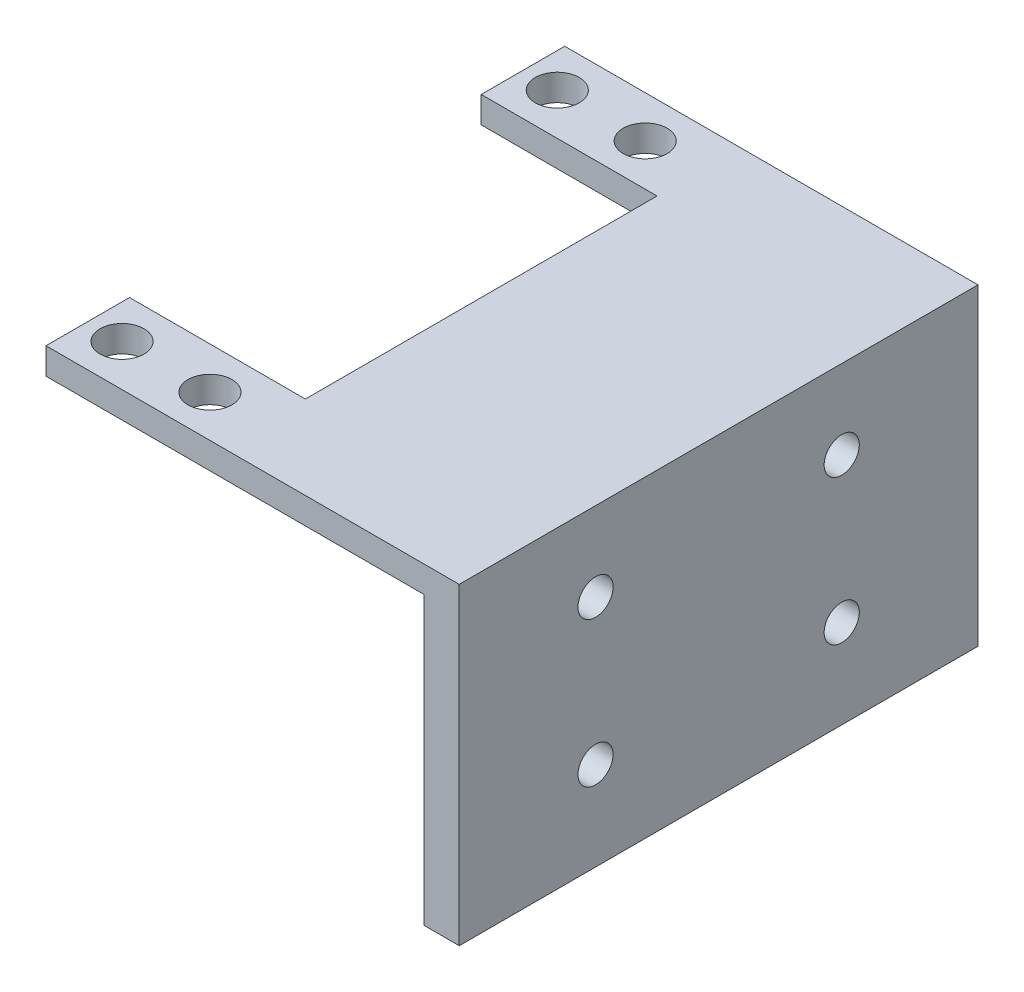
ISO-10303-21;
HEADER;
FILE_DESCRIPTION(('STEP AP214'),'2;1');
FILE_NAME('part.step','',(''),(''),'','','');
FILE_SCHEMA(('AUTOMOTIVE_DESIGN { 1 0 10303 214 1 1 1 1 }'));
ENDSEC;
DATA;
#1=APPLICATION_CONTEXT('core data for automotive mechanical design processes');
#2=APPLICATION_PROTOCOL_DEFINITION('international standard','automotive_design',2000,#1);
#3=PRODUCT_CONTEXT('',#1,'mechanical');
#4=PRODUCT('Part','Part','',(#3));
#5=PRODUCT_RELATED_PRODUCT_CATEGORY('part','',(#4));
#6=PRODUCT_DEFINITION_FORMATION('','',#4);
#7=PRODUCT_DEFINITION_CONTEXT('part definition',#1,'design');
#8=PRODUCT_DEFINITION('design','',#6,#7);
#9=PRODUCT_DEFINITION_SHAPE('','',#8);
#10=(LENGTH_UNIT() NAMED_UNIT(*) SI_UNIT(.MILLI.,.METRE.));
#11=(NAMED_UNIT(*) PLANE_ANGLE_UNIT() SI_UNIT($,.RADIAN.));
#12=(NAMED_UNIT(*) SI_UNIT($,.STERADIAN.) SOLID_ANGLE_UNIT());
#13=UNCERTAINTY_MEASURE_WITH_UNIT(LENGTH_MEASURE(1.E-05),#10,'distance_accuracy_value','');
#14=(GEOMETRIC_REPRESENTATION_CONTEXT(3) GLOBAL_UNCERTAINTY_ASSIGNED_CONTEXT((#13)) GLOBAL_UNIT_ASSIGNED_CONTEXT((#10,
#11,#12)) REPRESENTATION_CONTEXT('',''));
#15=CARTESIAN_POINT('',(0.,0.,0.));
#16=DIRECTION('',(0.,0.,1.));
#17=DIRECTION('',(1.,0.,0.));
#18=AXIS2_PLACEMENT_3D('',#15,#16,#17);
#19=CARTESIAN_POINT('',(0.,0.,59.));
#20=DIRECTION('',(1.,0.,0.));
#21=DIRECTION('',(0.,0.,-1.));
#22=AXIS2_PLACEMENT_3D('',#19,#20,#21);
#23=PLANE('',#22);
#24=DIRECTION('',(0.,0.,-1.));
#25=VECTOR('',#24,1.);
#26=CARTESIAN_POINT('',(0.,35.6,59.));
#27=LINE('',#26,#25);
#28=CARTESIAN_POINT('',(0.,35.6,59.));
#29=VERTEX_POINT('',#28);
#30=CARTESIAN_POINT('',(0.,35.6,49.5));
#31=VERTEX_POINT('',#30);
#32=EDGE_CURVE('E233',#29,#31,#27,.T.);
#33=ORIENTED_EDGE('',*,*,#32,.T.);
#34=DIRECTION('',(0.,-1.,0.));
#35=VECTOR('',#34,1.);
#36=CARTESIAN_POINT('',(0.,81.6,49.5));
#37=LINE('',#36,#35);
#38=CARTESIAN_POINT('',(0.,32.6,49.5));
#39=VERTEX_POINT('',#38);
#40=EDGE_CURVE('E148',#31,#39,#37,.T.);
#41=ORIENTED_EDGE('',*,*,#40,.T.);
#42=DIRECTION('',(0.,0.,1.));
#43=VECTOR('',#42,1.);
#44=CARTESIAN_POINT('',(0.,32.6,0.));
#45=LINE('',#44,#43);
#46=CARTESIAN_POINT('',(0.,32.6,59.));
#47=VERTEX_POINT('',#46);
#48=EDGE_CURVE('E181',#39,#47,#45,.T.);
#49=ORIENTED_EDGE('',*,*,#48,.T.);
#50=DIRECTION('',(0.,-1.,0.));
#51=VECTOR('',#50,1.);
#52=CARTESIAN_POINT('',(0.,0.,59.));
#53=LINE('',#52,#51);
#54=EDGE_CURVE('E206',#29,#47,#53,.T.);
#55=ORIENTED_EDGE('',*,*,#54,.F.);
#56=EDGE_LOOP('',(#33,#41,#49,#55));
#57=FACE_BOUND('',#56,.T.);
#58=ADVANCED_FACE('F40',(#57),#23,.F.);
#59=CARTESIAN_POINT('',(0.,32.6,0.));
#60=VERTEX_POINT('',#59);
#61=CARTESIAN_POINT('',(0.,32.6,9.5));
#62=VERTEX_POINT('',#61);
#63=EDGE_CURVE('E186',#60,#62,#45,.T.);
#64=ORIENTED_EDGE('',*,*,#63,.T.);
#65=DIRECTION('',(0.,-1.,0.));
#66=VECTOR('',#65,1.);
#67=CARTESIAN_POINT('',(0.,81.6,9.5));
#68=LINE('',#67,#66);
#69=CARTESIAN_POINT('',(0.,35.6,9.5));
#70=VERTEX_POINT('',#69);
#71=EDGE_CURVE('E56',#70,#62,#68,.T.);
#72=ORIENTED_EDGE('',*,*,#71,.F.);
#73=CARTESIAN_POINT('',(0.,35.6,0.));
#74=VERTEX_POINT('',#73);
#75=EDGE_CURVE('E220',#70,#74,#27,.T.);
#76=ORIENTED_EDGE('',*,*,#75,.T.);
#77=DIRECTION('',(0.,-1.,0.));
#78=VECTOR('',#77,1.);
#79=CARTESIAN_POINT('',(0.,0.,0.));
#80=LINE('',#79,#78);
#81=EDGE_CURVE('E202',#74,#60,#80,.T.);
#82=ORIENTED_EDGE('',*,*,#81,.T.);
#83=EDGE_LOOP('',(#64,#72,#76,#82));
#84=FACE_BOUND('',#83,.T.);
#85=ADVANCED_FACE('F42',(#84),#23,.F.);
#86=CARTESIAN_POINT('',(0.,0.,59.));
#87=DIRECTION('',(0.,0.,-1.));
#88=DIRECTION('',(-1.,0.,0.));
#89=AXIS2_PLACEMENT_3D('',#86,#87,#88);
#90=PLANE('',#89);
#91=DIRECTION('',(-1.,0.,0.));
#92=VECTOR('',#91,1.);
#93=CARTESIAN_POINT('',(43.,32.6,59.));
#94=LINE('',#93,#92);
#95=CARTESIAN_POINT('',(43.,32.6,59.));
#96=VERTEX_POINT('',#95);
#97=EDGE_CURVE('E195',#96,#47,#94,.T.);
#98=ORIENTED_EDGE('',*,*,#97,.F.);
#99=DIRECTION('',(0.,-1.,0.));
#100=VECTOR('',#99,1.);
#101=CARTESIAN_POINT('',(43.,32.6,59.));
#102=LINE('',#101,#100);
#103=CARTESIAN_POINT('',(43.,0.,59.));
#104=VERTEX_POINT('',#103);
#105=EDGE_CURVE('E185',#96,#104,#102,.T.);
#106=ORIENTED_EDGE('',*,*,#105,.T.);
#107=DIRECTION('',(1.,0.,0.));
#108=VECTOR('',#107,1.);
#109=CARTESIAN_POINT('',(0.,0.,59.));
#110=LINE('',#109,#108);
#111=CARTESIAN_POINT('',(47.,0.,59.));
#112=VERTEX_POINT('',#111);
#113=EDGE_CURVE('E210',#104,#112,#110,.T.);
#114=ORIENTED_EDGE('',*,*,#113,.T.);
#115=DIRECTION('',(0.,1.,0.));
#116=VECTOR('',#115,1.);
#117=CARTESIAN_POINT('',(47.,0.,59.));
#118=LINE('',#117,#116);
#119=CARTESIAN_POINT('',(47.,35.6,59.));
#120=VERTEX_POINT('',#119);
#121=EDGE_CURVE('E214',#112,#120,#118,.T.);
#122=ORIENTED_EDGE('',*,*,#121,.T.);
#123=DIRECTION('',(-1.,0.,0.));
#124=VECTOR('',#123,1.);
#125=CARTESIAN_POINT('',(0.,35.6,59.));
#126=LINE('',#125,#124);
#127=EDGE_CURVE('E217',#120,#29,#126,.T.);
#128=ORIENTED_EDGE('',*,*,#127,.T.);
#129=ORIENTED_EDGE('',*,*,#54,.T.);
#130=EDGE_LOOP('',(#98,#106,#114,#122,#128,#129));
#131=FACE_BOUND('',#130,.T.);
#132=ADVANCED_FACE('F291',(#131),#90,.F.);
#133=CARTESIAN_POINT('',(0.,0.,0.));
#134=DIRECTION('',(0.,0.,-1.));
#135=DIRECTION('',(-1.,0.,0.));
#136=AXIS2_PLACEMENT_3D('',#133,#134,#135);
#137=PLANE('',#136);
#138=DIRECTION('',(0.,-1.,0.));
#139=VECTOR('',#138,1.);
#140=CARTESIAN_POINT('',(43.,32.6,0.));
#141=LINE('',#140,#139);
#142=CARTESIAN_POINT('',(43.,32.6,0.));
#143=VERTEX_POINT('',#142);
#144=CARTESIAN_POINT('',(43.,0.,0.));
#145=VERTEX_POINT('',#144);
#146=EDGE_CURVE('E192',#143,#145,#141,.T.);
#147=ORIENTED_EDGE('',*,*,#146,.F.);
#148=DIRECTION('',(-1.,0.,0.));
#149=VECTOR('',#148,1.);
#150=CARTESIAN_POINT('',(43.,32.6,0.));
#151=LINE('',#150,#149);
#152=EDGE_CURVE('E198',#143,#60,#151,.T.);
#153=ORIENTED_EDGE('',*,*,#152,.T.);
#154=ORIENTED_EDGE('',*,*,#81,.F.);
#155=DIRECTION('',(-1.,0.,0.));
#156=VECTOR('',#155,1.);
#157=CARTESIAN_POINT('',(0.,35.6,0.));
#158=LINE('',#157,#156);
#159=CARTESIAN_POINT('',(47.,35.6,0.));
#160=VERTEX_POINT('',#159);
#161=EDGE_CURVE('E211',#160,#74,#158,.T.);
#162=ORIENTED_EDGE('',*,*,#161,.F.);
#163=DIRECTION('',(0.,1.,0.));
#164=VECTOR('',#163,1.);
#165=CARTESIAN_POINT('',(47.,0.,0.));
#166=LINE('',#165,#164);
#167=CARTESIAN_POINT('',(47.,0.,0.));
#168=VERTEX_POINT('',#167);
#169=EDGE_CURVE('E227',#168,#160,#166,.T.);
#170=ORIENTED_EDGE('',*,*,#169,.F.);
#171=DIRECTION('',(1.,0.,0.));
#172=VECTOR('',#171,1.);
#173=CARTESIAN_POINT('',(0.,0.,0.));
#174=LINE('',#173,#172);
#175=EDGE_CURVE('E224',#145,#168,#174,.T.);
#176=ORIENTED_EDGE('',*,*,#175,.F.);
#177=EDGE_LOOP('',(#147,#153,#154,#162,#170,#176));
#178=FACE_BOUND('',#177,.T.);
#179=ADVANCED_FACE('F252',(#178),#137,.T.);
#180=CARTESIAN_POINT('',(0.,0.,59.));
#181=DIRECTION('',(0.,1.,0.));
#182=DIRECTION('',(0.,0.,1.));
#183=AXIS2_PLACEMENT_3D('',#180,#181,#182);
#184=PLANE('',#183);
#185=ORIENTED_EDGE('',*,*,#113,.F.);
#186=DIRECTION('',(0.,0.,1.));
#187=VECTOR('',#186,1.);
#188=CARTESIAN_POINT('',(43.,0.,0.));
#189=LINE('',#188,#187);
#190=EDGE_CURVE('E182',#145,#104,#189,.T.);
#191=ORIENTED_EDGE('',*,*,#190,.F.);
#192=ORIENTED_EDGE('',*,*,#175,.T.);
#193=DIRECTION('',(0.,0.,-1.));
#194=VECTOR('',#193,1.);
#195=CARTESIAN_POINT('',(47.,0.,59.));
#196=LINE('',#195,#194);
#197=EDGE_CURVE('E11',#112,#168,#196,.T.);
#198=ORIENTED_EDGE('',*,*,#197,.F.);
#199=EDGE_LOOP('',(#185,#191,#192,#198));
#200=FACE_BOUND('',#199,.T.);
#201=ADVANCED_FACE('F317',(#200),#184,.F.);
#202=CARTESIAN_POINT('',(47.,0.,59.));
#203=DIRECTION('',(-1.,0.,0.));
#204=DIRECTION('',(0.,0.,1.));
#205=AXIS2_PLACEMENT_3D('',#202,#203,#204);
#206=PLANE('',#205);
#207=CARTESIAN_POINT('',(47.,26.6,43.5));
#208=DIRECTION('',(-1.,0.,0.));
#209=DIRECTION('',(0.,0.,1.));
#210=AXIS2_PLACEMENT_3D('',#207,#208,#209);
#211=CIRCLE('',#210,2.);
#212=CARTESIAN_POINT('',(47.,26.6,45.5));
#213=VERTEX_POINT('',#212);
#214=EDGE_CURVE('E524',#213,#213,#211,.T.);
#215=ORIENTED_EDGE('',*,*,#214,.T.);
#216=EDGE_LOOP('',(#215));
#217=FACE_BOUND('',#216,.T.);
#218=CARTESIAN_POINT('',(47.,10.1,15.5));
#219=DIRECTION('',(-1.,0.,0.));
#220=DIRECTION('',(0.,0.,1.));
#221=AXIS2_PLACEMENT_3D('',#218,#219,#220);
#222=CIRCLE('',#221,2.);
#223=CARTESIAN_POINT('',(47.,10.1,17.5));
#224=VERTEX_POINT('',#223);
#225=EDGE_CURVE('E527',#224,#224,#222,.T.);
#226=ORIENTED_EDGE('',*,*,#225,.T.);
#227=EDGE_LOOP('',(#226));
#228=FACE_BOUND('',#227,.T.);
#229=CARTESIAN_POINT('',(47.,10.1,43.5));
#230=DIRECTION('',(-1.,0.,0.));
#231=DIRECTION('',(0.,0.,1.));
#232=AXIS2_PLACEMENT_3D('',#229,#230,#231);
#233=CIRCLE('',#232,2.);
#234=CARTESIAN_POINT('',(47.,10.1,45.5));
#235=VERTEX_POINT('',#234);
#236=EDGE_CURVE('E536',#235,#235,#233,.T.);
#237=ORIENTED_EDGE('',*,*,#236,.T.);
#238=EDGE_LOOP('',(#237));
#239=FACE_BOUND('',#238,.T.);
#240=CARTESIAN_POINT('',(47.,26.6,15.5));
#241=DIRECTION('',(-1.,0.,0.));
#242=DIRECTION('',(0.,0.,1.));
#243=AXIS2_PLACEMENT_3D('',#240,#241,#242);
#244=CIRCLE('',#243,2.);
#245=CARTESIAN_POINT('',(47.,26.6,17.5));
#246=VERTEX_POINT('',#245);
#247=EDGE_CURVE('E574',#246,#246,#244,.T.);
#248=ORIENTED_EDGE('',*,*,#247,.T.);
#249=EDGE_LOOP('',(#248));
#250=FACE_BOUND('',#249,.T.);
#251=ORIENTED_EDGE('',*,*,#169,.T.);
#252=DIRECTION('',(0.,0.,-1.));
#253=VECTOR('',#252,1.);
#254=CARTESIAN_POINT('',(47.,35.6,59.));
#255=LINE('',#254,#253);
#256=EDGE_CURVE('E49',#120,#160,#255,.T.);
#257=ORIENTED_EDGE('',*,*,#256,.F.);
#258=ORIENTED_EDGE('',*,*,#121,.F.);
#259=ORIENTED_EDGE('',*,*,#197,.T.);
#260=EDGE_LOOP('',(#251,#257,#258,#259));
#261=FACE_BOUND('',#260,.T.);
#262=ADVANCED_FACE('F323',(#217,#228,#239,#250,#261),#206,.F.);
#263=CARTESIAN_POINT('',(0.,35.6,59.));
#264=DIRECTION('',(0.,-1.,0.));
#265=DIRECTION('',(0.,0.,-1.));
#266=AXIS2_PLACEMENT_3D('',#263,#264,#265);
#267=PLANE('',#266);
#268=CARTESIAN_POINT('',(3.9,35.6,54.25));
#269=DIRECTION('',(0.,-1.,0.));
#270=DIRECTION('',(0.,0.,-1.));
#271=AXIS2_PLACEMENT_3D('',#268,#269,#270);
#272=CIRCLE('',#271,2.5);
#273=CARTESIAN_POINT('',(3.9,35.6,51.75));
#274=VERTEX_POINT('',#273);
#275=EDGE_CURVE('E177',#274,#274,#272,.T.);
#276=ORIENTED_EDGE('',*,*,#275,.T.);
#277=EDGE_LOOP('',(#276));
#278=FACE_BOUND('',#277,.T.);
#279=CARTESIAN_POINT('',(13.9,35.6,4.75));
#280=DIRECTION('',(0.,-1.,0.));
#281=DIRECTION('',(0.,0.,-1.));
#282=AXIS2_PLACEMENT_3D('',#279,#280,#281);
#283=CIRCLE('',#282,2.49999999999999);
#284=CARTESIAN_POINT('',(13.9,35.6,2.25));
#285=VERTEX_POINT('',#284);
#286=EDGE_CURVE('E173',#285,#285,#283,.T.);
#287=ORIENTED_EDGE('',*,*,#286,.T.);
#288=EDGE_LOOP('',(#287));
#289=FACE_BOUND('',#288,.T.);
#290=CARTESIAN_POINT('',(13.9,35.6,54.25));
#291=DIRECTION('',(0.,-1.,0.));
#292=DIRECTION('',(0.,0.,-1.));
#293=AXIS2_PLACEMENT_3D('',#290,#291,#292);
#294=CIRCLE('',#293,2.5);
#295=CARTESIAN_POINT('',(13.9,35.6,51.75));
#296=VERTEX_POINT('',#295);
#297=EDGE_CURVE('E169',#296,#296,#294,.T.);
#298=ORIENTED_EDGE('',*,*,#297,.T.);
#299=EDGE_LOOP('',(#298));
#300=FACE_BOUND('',#299,.T.);
#301=CARTESIAN_POINT('',(3.9,35.6,4.75));
#302=DIRECTION('',(0.,-1.,0.));
#303=DIRECTION('',(0.,0.,-1.));
#304=AXIS2_PLACEMENT_3D('',#301,#302,#303);
#305=CIRCLE('',#304,2.5);
#306=CARTESIAN_POINT('',(3.9,35.6,2.25));
#307=VERTEX_POINT('',#306);
#308=EDGE_CURVE('E165',#307,#307,#305,.T.);
#309=ORIENTED_EDGE('',*,*,#308,.T.);
#310=EDGE_LOOP('',(#309));
#311=FACE_BOUND('',#310,.T.);
#312=DIRECTION('',(0.,0.,1.));
#313=VECTOR('',#312,1.);
#314=CARTESIAN_POINT('',(20.,35.6,59.));
#315=LINE('',#314,#313);
#316=CARTESIAN_POINT('',(20.,35.6,9.5));
#317=VERTEX_POINT('',#316);
#318=CARTESIAN_POINT('',(20.,35.6,49.5));
#319=VERTEX_POINT('',#318);
#320=EDGE_CURVE('E126',#317,#319,#315,.T.);
#321=ORIENTED_EDGE('',*,*,#320,.T.);
#322=DIRECTION('',(-1.,0.,0.));
#323=VECTOR('',#322,1.);
#324=CARTESIAN_POINT('',(0.,35.6,49.5));
#325=LINE('',#324,#323);
#326=EDGE_CURVE('E161',#319,#31,#325,.T.);
#327=ORIENTED_EDGE('',*,*,#326,.T.);
#328=ORIENTED_EDGE('',*,*,#32,.F.);
#329=ORIENTED_EDGE('',*,*,#127,.F.);
#330=ORIENTED_EDGE('',*,*,#256,.T.);
#331=ORIENTED_EDGE('',*,*,#161,.T.);
#332=ORIENTED_EDGE('',*,*,#75,.F.);
#333=DIRECTION('',(1.,0.,0.));
#334=VECTOR('',#333,1.);
#335=CARTESIAN_POINT('',(0.,35.6,9.5));
#336=LINE('',#335,#334);
#337=EDGE_CURVE('E152',#70,#317,#336,.T.);
#338=ORIENTED_EDGE('',*,*,#337,.T.);
#339=EDGE_LOOP('',(#321,#327,#328,#329,#330,#331,#332,#338));
#340=FACE_BOUND('',#339,.T.);
#341=ADVANCED_FACE('F243',(#278,#289,#300,#311,#340),#267,.F.);
#342=CARTESIAN_POINT('',(43.,32.6,0.));
#343=DIRECTION('',(0.,-1.,0.));
#344=DIRECTION('',(0.,0.,-1.));
#345=AXIS2_PLACEMENT_3D('',#342,#343,#344);
#346=PLANE('',#345);
#347=CARTESIAN_POINT('',(3.9,32.6,54.25));
#348=DIRECTION('',(0.,-1.,0.));
#349=DIRECTION('',(0.,0.,-1.));
#350=AXIS2_PLACEMENT_3D('',#347,#348,#349);
#351=CIRCLE('',#350,2.5);
#352=CARTESIAN_POINT('',(3.9,32.6,51.75));
#353=VERTEX_POINT('',#352);
#354=EDGE_CURVE('E136',#353,#353,#351,.T.);
#355=ORIENTED_EDGE('',*,*,#354,.F.);
#356=EDGE_LOOP('',(#355));
#357=FACE_BOUND('',#356,.T.);
#358=CARTESIAN_POINT('',(13.9,32.6,4.75));
#359=DIRECTION('',(0.,-1.,0.));
#360=DIRECTION('',(0.,0.,1.));
#361=AXIS2_PLACEMENT_3D('',#358,#359,#360);
#362=CIRCLE('',#361,2.49999999999999);
#363=CARTESIAN_POINT('',(13.9,32.6,7.24999999999999));
#364=VERTEX_POINT('',#363);
#365=EDGE_CURVE('E542',#364,#364,#362,.T.);
#366=ORIENTED_EDGE('',*,*,#365,.F.);
#367=EDGE_LOOP('',(#366));
#368=FACE_BOUND('',#367,.T.);
#369=CARTESIAN_POINT('',(13.9,32.6,54.25));
#370=DIRECTION('',(0.,-1.,0.));
#371=DIRECTION('',(0.,0.,-1.));
#372=AXIS2_PLACEMENT_3D('',#369,#370,#371);
#373=CIRCLE('',#372,2.5);
#374=CARTESIAN_POINT('',(13.9,32.6,51.75));
#375=VERTEX_POINT('',#374);
#376=EDGE_CURVE('E533',#375,#375,#373,.T.);
#377=ORIENTED_EDGE('',*,*,#376,.F.);
#378=EDGE_LOOP('',(#377));
#379=FACE_BOUND('',#378,.T.);
#380=CARTESIAN_POINT('',(3.9,32.6,4.75));
#381=DIRECTION('',(0.,-1.,0.));
#382=DIRECTION('',(0.,0.,1.));
#383=AXIS2_PLACEMENT_3D('',#380,#381,#382);
#384=CIRCLE('',#383,2.5);
#385=CARTESIAN_POINT('',(3.9,32.6,7.24999999999999));
#386=VERTEX_POINT('',#385);
#387=EDGE_CURVE('E526',#386,#386,#384,.T.);
#388=ORIENTED_EDGE('',*,*,#387,.F.);
#389=EDGE_LOOP('',(#388));
#390=FACE_BOUND('',#389,.T.);
#391=DIRECTION('',(-1.,0.,0.));
#392=VECTOR('',#391,1.);
#393=CARTESIAN_POINT('',(0.,32.6,49.5));
#394=LINE('',#393,#392);
#395=CARTESIAN_POINT('',(20.,32.6,49.5));
#396=VERTEX_POINT('',#395);
#397=EDGE_CURVE('E140',#396,#39,#394,.T.);
#398=ORIENTED_EDGE('',*,*,#397,.F.);
#399=DIRECTION('',(0.,0.,1.));
#400=VECTOR('',#399,1.);
#401=CARTESIAN_POINT('',(20.,32.6,9.5));
#402=LINE('',#401,#400);
#403=CARTESIAN_POINT('',(20.,32.6,9.5));
#404=VERTEX_POINT('',#403);
#405=EDGE_CURVE('E123',#404,#396,#402,.T.);
#406=ORIENTED_EDGE('',*,*,#405,.F.);
#407=DIRECTION('',(1.,0.,0.));
#408=VECTOR('',#407,1.);
#409=CARTESIAN_POINT('',(0.,32.6,9.5));
#410=LINE('',#409,#408);
#411=EDGE_CURVE('E131',#62,#404,#410,.T.);
#412=ORIENTED_EDGE('',*,*,#411,.F.);
#413=ORIENTED_EDGE('',*,*,#63,.F.);
#414=ORIENTED_EDGE('',*,*,#152,.F.);
#415=DIRECTION('',(0.,0.,1.));
#416=VECTOR('',#415,1.);
#417=CARTESIAN_POINT('',(43.,32.6,0.));
#418=LINE('',#417,#416);
#419=EDGE_CURVE('E64',#143,#96,#418,.T.);
#420=ORIENTED_EDGE('',*,*,#419,.T.);
#421=ORIENTED_EDGE('',*,*,#97,.T.);
#422=ORIENTED_EDGE('',*,*,#48,.F.);
#423=EDGE_LOOP('',(#398,#406,#412,#413,#414,#420,#421,#422));
#424=FACE_BOUND('',#423,.T.);
#425=ADVANCED_FACE('F138',(#357,#368,#379,#390,#424),#346,.T.);
#426=CARTESIAN_POINT('',(43.,0.,0.));
#427=DIRECTION('',(1.,0.,0.));
#428=DIRECTION('',(0.,0.,-1.));
#429=AXIS2_PLACEMENT_3D('',#426,#427,#428);
#430=PLANE('',#429);
#431=CARTESIAN_POINT('',(43.,26.6,43.5));
#432=DIRECTION('',(-1.,0.,0.));
#433=DIRECTION('',(0.,0.,1.));
#434=AXIS2_PLACEMENT_3D('',#431,#432,#433);
#435=CIRCLE('',#434,2.);
#436=CARTESIAN_POINT('',(43.,26.6,45.5));
#437=VERTEX_POINT('',#436);
#438=EDGE_CURVE('E521',#437,#437,#435,.T.);
#439=ORIENTED_EDGE('',*,*,#438,.F.);
#440=EDGE_LOOP('',(#439));
#441=FACE_BOUND('',#440,.T.);
#442=CARTESIAN_POINT('',(43.,10.1,15.5));
#443=DIRECTION('',(-1.,0.,0.));
#444=DIRECTION('',(0.,0.,1.));
#445=AXIS2_PLACEMENT_3D('',#442,#443,#444);
#446=CIRCLE('',#445,2.);
#447=CARTESIAN_POINT('',(43.,10.1,17.5));
#448=VERTEX_POINT('',#447);
#449=EDGE_CURVE('E585',#448,#448,#446,.T.);
#450=ORIENTED_EDGE('',*,*,#449,.F.);
#451=EDGE_LOOP('',(#450));
#452=FACE_BOUND('',#451,.T.);
#453=CARTESIAN_POINT('',(43.,10.1,43.5));
#454=DIRECTION('',(-1.,0.,0.));
#455=DIRECTION('',(0.,0.,1.));
#456=AXIS2_PLACEMENT_3D('',#453,#454,#455);
#457=CIRCLE('',#456,2.);
#458=CARTESIAN_POINT('',(43.,10.1,45.5));
#459=VERTEX_POINT('',#458);
#460=EDGE_CURVE('E582',#459,#459,#457,.T.);
#461=ORIENTED_EDGE('',*,*,#460,.F.);
#462=EDGE_LOOP('',(#461));
#463=FACE_BOUND('',#462,.T.);
#464=CARTESIAN_POINT('',(43.,26.6,15.5));
#465=DIRECTION('',(-1.,0.,0.));
#466=DIRECTION('',(0.,0.,1.));
#467=AXIS2_PLACEMENT_3D('',#464,#465,#466);
#468=CIRCLE('',#467,2.);
#469=CARTESIAN_POINT('',(43.,26.6,17.5));
#470=VERTEX_POINT('',#469);
#471=EDGE_CURVE('E578',#470,#470,#468,.T.);
#472=ORIENTED_EDGE('',*,*,#471,.F.);
#473=EDGE_LOOP('',(#472));
#474=FACE_BOUND('',#473,.T.);
#475=ORIENTED_EDGE('',*,*,#190,.T.);
#476=ORIENTED_EDGE('',*,*,#105,.F.);
#477=ORIENTED_EDGE('',*,*,#419,.F.);
#478=ORIENTED_EDGE('',*,*,#146,.T.);
#479=EDGE_LOOP('',(#475,#476,#477,#478));
#480=FACE_BOUND('',#479,.T.);
#481=ADVANCED_FACE('F295',(#441,#452,#463,#474,#480),#430,.F.);
#482=CARTESIAN_POINT('',(0.,81.6,49.5));
#483=DIRECTION('',(0.,0.,1.));
#484=DIRECTION('',(1.,0.,0.));
#485=AXIS2_PLACEMENT_3D('',#482,#483,#484);
#486=PLANE('',#485);
#487=DIRECTION('',(0.,-1.,0.));
#488=VECTOR('',#487,1.);
#489=CARTESIAN_POINT('',(20.,81.6,49.5));
#490=LINE('',#489,#488);
#491=EDGE_CURVE('E129',#319,#396,#490,.T.);
#492=ORIENTED_EDGE('',*,*,#491,.T.);
#493=ORIENTED_EDGE('',*,*,#397,.T.);
#494=ORIENTED_EDGE('',*,*,#40,.F.);
#495=ORIENTED_EDGE('',*,*,#326,.F.);
#496=EDGE_LOOP('',(#492,#493,#494,#495));
#497=FACE_BOUND('',#496,.T.);
#498=ADVANCED_FACE('F293',(#497),#486,.F.);
#499=CARTESIAN_POINT('',(20.,81.6,9.5));
#500=DIRECTION('',(1.,0.,0.));
#501=DIRECTION('',(0.,0.,-1.));
#502=AXIS2_PLACEMENT_3D('',#499,#500,#501);
#503=PLANE('',#502);
#504=DIRECTION('',(0.,-1.,0.));
#505=VECTOR('',#504,1.);
#506=CARTESIAN_POINT('',(20.,81.6,9.5));
#507=LINE('',#506,#505);
#508=EDGE_CURVE('E119',#317,#404,#507,.T.);
#509=ORIENTED_EDGE('',*,*,#508,.T.);
#510=ORIENTED_EDGE('',*,*,#405,.T.);
#511=ORIENTED_EDGE('',*,*,#491,.F.);
#512=ORIENTED_EDGE('',*,*,#320,.F.);
#513=EDGE_LOOP('',(#509,#510,#511,#512));
#514=FACE_BOUND('',#513,.T.);
#515=ADVANCED_FACE('F120',(#514),#503,.F.);
#516=CARTESIAN_POINT('',(0.,81.6,9.5));
#517=DIRECTION('',(0.,0.,-1.));
#518=DIRECTION('',(-1.,0.,0.));
#519=AXIS2_PLACEMENT_3D('',#516,#517,#518);
#520=PLANE('',#519);
#521=ORIENTED_EDGE('',*,*,#71,.T.);
#522=ORIENTED_EDGE('',*,*,#411,.T.);
#523=ORIENTED_EDGE('',*,*,#508,.F.);
#524=ORIENTED_EDGE('',*,*,#337,.F.);
#525=EDGE_LOOP('',(#521,#522,#523,#524));
#526=FACE_BOUND('',#525,.T.);
#527=ADVANCED_FACE('F132',(#526),#520,.F.);
#528=CARTESIAN_POINT('',(3.9,81.6,4.75));
#529=DIRECTION('',(0.,-1.,0.));
#530=DIRECTION('',(0.,0.,-1.));
#531=AXIS2_PLACEMENT_3D('',#528,#529,#530);
#532=CYLINDRICAL_SURFACE('',#531,2.5);
#533=ORIENTED_EDGE('',*,*,#387,.T.);
#534=EDGE_LOOP('',(#533));
#535=FACE_BOUND('',#534,.T.);
#536=ORIENTED_EDGE('',*,*,#308,.F.);
#537=EDGE_LOOP('',(#536));
#538=FACE_BOUND('',#537,.T.);
#539=ADVANCED_FACE('F374',(#535,#538),#532,.F.);
#540=CARTESIAN_POINT('',(13.9,81.6,54.25));
#541=DIRECTION('',(0.,-1.,0.));
#542=DIRECTION('',(0.,0.,-1.));
#543=AXIS2_PLACEMENT_3D('',#540,#541,#542);
#544=CYLINDRICAL_SURFACE('',#543,2.5);
#545=ORIENTED_EDGE('',*,*,#376,.T.);
#546=EDGE_LOOP('',(#545));
#547=FACE_BOUND('',#546,.T.);
#548=ORIENTED_EDGE('',*,*,#297,.F.);
#549=EDGE_LOOP('',(#548));
#550=FACE_BOUND('',#549,.T.);
#551=ADVANCED_FACE('F383',(#547,#550),#544,.F.);
#552=CARTESIAN_POINT('',(13.9,81.6,4.75));
#553=DIRECTION('',(0.,-1.,0.));
#554=DIRECTION('',(0.,0.,-1.));
#555=AXIS2_PLACEMENT_3D('',#552,#553,#554);
#556=CYLINDRICAL_SURFACE('',#555,2.49999999999999);
#557=ORIENTED_EDGE('',*,*,#365,.T.);
#558=EDGE_LOOP('',(#557));
#559=FACE_BOUND('',#558,.T.);
#560=ORIENTED_EDGE('',*,*,#286,.F.);
#561=EDGE_LOOP('',(#560));
#562=FACE_BOUND('',#561,.T.);
#563=ADVANCED_FACE('F393',(#559,#562),#556,.F.);
#564=CARTESIAN_POINT('',(3.9,81.6,54.25));
#565=DIRECTION('',(0.,-1.,0.));
#566=DIRECTION('',(0.,0.,-1.));
#567=AXIS2_PLACEMENT_3D('',#564,#565,#566);
#568=CYLINDRICAL_SURFACE('',#567,2.5);
#569=ORIENTED_EDGE('',*,*,#354,.T.);
#570=EDGE_LOOP('',(#569));
#571=FACE_BOUND('',#570,.T.);
#572=ORIENTED_EDGE('',*,*,#275,.F.);
#573=EDGE_LOOP('',(#572));
#574=FACE_BOUND('',#573,.T.);
#575=ADVANCED_FACE('F403',(#571,#574),#568,.F.);
#576=CARTESIAN_POINT('',(53.,26.6,15.5));
#577=DIRECTION('',(-1.,0.,0.));
#578=DIRECTION('',(0.,0.,1.));
#579=AXIS2_PLACEMENT_3D('',#576,#577,#578);
#580=CYLINDRICAL_SURFACE('',#579,2.);
#581=ORIENTED_EDGE('',*,*,#471,.T.);
#582=EDGE_LOOP('',(#581));
#583=FACE_BOUND('',#582,.T.);
#584=ORIENTED_EDGE('',*,*,#247,.F.);
#585=EDGE_LOOP('',(#584));
#586=FACE_BOUND('',#585,.T.);
#587=ADVANCED_FACE('F412',(#583,#586),#580,.F.);
#588=CARTESIAN_POINT('',(53.,10.1,43.5));
#589=DIRECTION('',(-1.,0.,0.));
#590=DIRECTION('',(0.,0.,1.));
#591=AXIS2_PLACEMENT_3D('',#588,#589,#590);
#592=CYLINDRICAL_SURFACE('',#591,2.);
#593=ORIENTED_EDGE('',*,*,#460,.T.);
#594=EDGE_LOOP('',(#593));
#595=FACE_BOUND('',#594,.T.);
#596=ORIENTED_EDGE('',*,*,#236,.F.);
#597=EDGE_LOOP('',(#596));
#598=FACE_BOUND('',#597,.T.);
#599=ADVANCED_FACE('F421',(#595,#598),#592,.F.);
#600=CARTESIAN_POINT('',(53.,10.1,15.5));
#601=DIRECTION('',(-1.,0.,0.));
#602=DIRECTION('',(0.,0.,1.));
#603=AXIS2_PLACEMENT_3D('',#600,#601,#602);
#604=CYLINDRICAL_SURFACE('',#603,2.);
#605=ORIENTED_EDGE('',*,*,#449,.T.);
#606=EDGE_LOOP('',(#605));
#607=FACE_BOUND('',#606,.T.);
#608=ORIENTED_EDGE('',*,*,#225,.F.);
#609=EDGE_LOOP('',(#608));
#610=FACE_BOUND('',#609,.T.);
#611=ADVANCED_FACE('F431',(#607,#610),#604,.F.);
#612=CARTESIAN_POINT('',(53.,26.6,43.5));
#613=DIRECTION('',(-1.,0.,0.));
#614=DIRECTION('',(0.,0.,1.));
#615=AXIS2_PLACEMENT_3D('',#612,#613,#614);
#616=CYLINDRICAL_SURFACE('',#615,2.);
#617=ORIENTED_EDGE('',*,*,#438,.T.);
#618=EDGE_LOOP('',(#617));
#619=FACE_BOUND('',#618,.T.);
#620=ORIENTED_EDGE('',*,*,#214,.F.);
#621=EDGE_LOOP('',(#620));
#622=FACE_BOUND('',#621,.T.);
#623=ADVANCED_FACE('F441',(#619,#622),#616,.F.);
#624=CLOSED_SHELL('',(#58,#85,#132,#179,#201,#262,#341,#425,#481,#498,#515,#527,#539,#551,#563,
#575,#587,#599,#611,#623));
#625=MANIFOLD_SOLID_BREP('B2',#624);
#626=ADVANCED_BREP_SHAPE_REPRESENTATION('',(#18,#625),#14);
#627=SHAPE_DEFINITION_REPRESENTATION(#9,#626);
ENDSEC;
END-ISO-10303-21;
